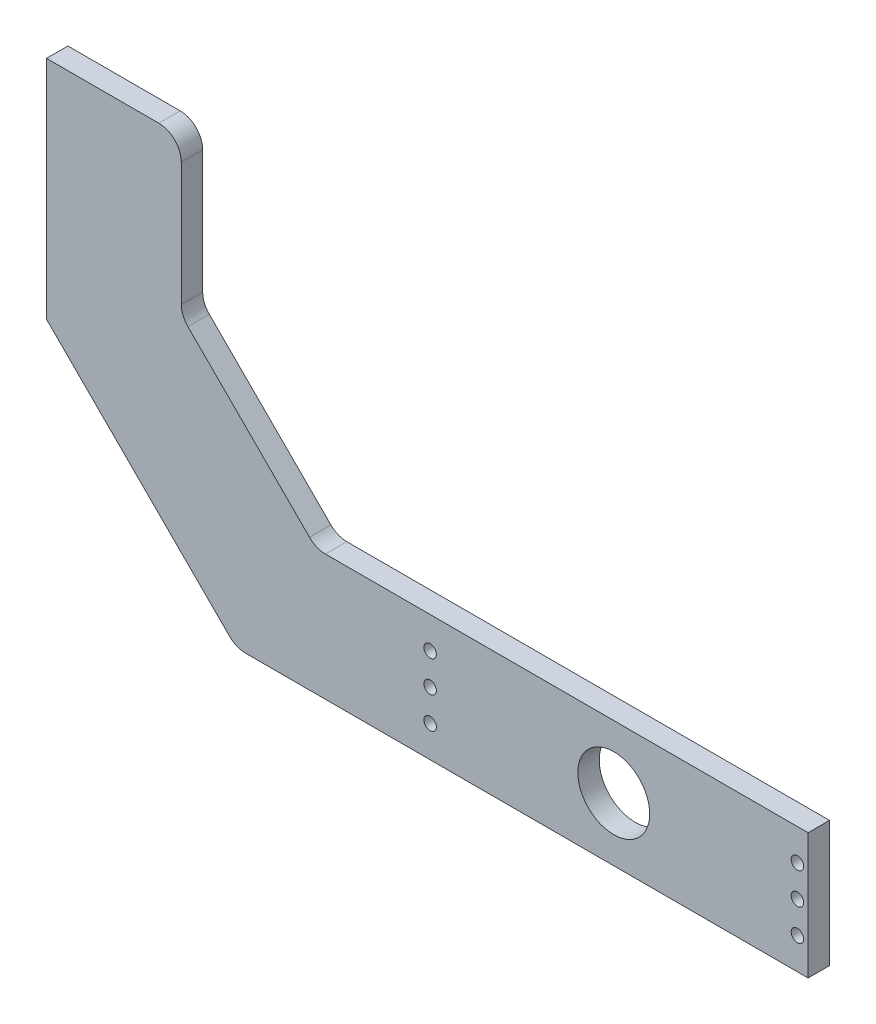
ISO-10303-21;
HEADER;
FILE_DESCRIPTION(('STEP AP214'),'2;1');
FILE_NAME('part.step','',(''),(''),'','','');
FILE_SCHEMA(('AUTOMOTIVE_DESIGN { 1 0 10303 214 1 1 1 1 }'));
ENDSEC;
DATA;
#1=APPLICATION_CONTEXT('core data for automotive mechanical design processes');
#2=APPLICATION_PROTOCOL_DEFINITION('international standard','automotive_design',2000,#1);
#3=PRODUCT_CONTEXT('',#1,'mechanical');
#4=PRODUCT('Part','Part','',(#3));
#5=PRODUCT_RELATED_PRODUCT_CATEGORY('part','',(#4));
#6=PRODUCT_DEFINITION_FORMATION('','',#4);
#7=PRODUCT_DEFINITION_CONTEXT('part definition',#1,'design');
#8=PRODUCT_DEFINITION('design','',#6,#7);
#9=PRODUCT_DEFINITION_SHAPE('','',#8);
#10=(LENGTH_UNIT() NAMED_UNIT(*) SI_UNIT(.MILLI.,.METRE.));
#11=(NAMED_UNIT(*) PLANE_ANGLE_UNIT() SI_UNIT($,.RADIAN.));
#12=(NAMED_UNIT(*) SI_UNIT($,.STERADIAN.) SOLID_ANGLE_UNIT());
#13=UNCERTAINTY_MEASURE_WITH_UNIT(LENGTH_MEASURE(1.E-05),#10,'distance_accuracy_value','');
#14=(GEOMETRIC_REPRESENTATION_CONTEXT(3) GLOBAL_UNCERTAINTY_ASSIGNED_CONTEXT((#13)) GLOBAL_UNIT_ASSIGNED_CONTEXT((#10,
#11,#12)) REPRESENTATION_CONTEXT('',''));
#15=CARTESIAN_POINT('',(0.,0.,0.));
#16=DIRECTION('',(0.,0.,1.));
#17=DIRECTION('',(1.,0.,0.));
#18=AXIS2_PLACEMENT_3D('',#15,#16,#17);
#19=CARTESIAN_POINT('',(18.4222454265078,-36.0239718131345,9.525));
#20=DIRECTION('',(0.,-1.,0.));
#21=DIRECTION('',(1.,0.,0.));
#22=AXIS2_PLACEMENT_3D('',#19,#20,#21);
#23=PLANE('',#22);
#24=DIRECTION('',(-1.,0.,0.));
#25=VECTOR('',#24,1.);
#26=CARTESIAN_POINT('',(18.4222454265078,-36.0239718131345,0.));
#27=LINE('',#26,#25);
#28=CARTESIAN_POINT('',(224.714042280299,-36.0239718131342,0.));
#29=VERTEX_POINT('',#28);
#30=CARTESIAN_POINT('',(9.85617790402953,-36.0239718131345,0.));
#31=VERTEX_POINT('',#30);
#32=EDGE_CURVE('E162',#29,#31,#27,.T.);
#33=ORIENTED_EDGE('',*,*,#32,.T.);
#34=DIRECTION('',(0.,0.,-1.));
#35=VECTOR('',#34,1.);
#36=CARTESIAN_POINT('',(9.85617790402953,-36.0239718131345,9.525));
#37=LINE('',#36,#35);
#38=CARTESIAN_POINT('',(9.85617790402953,-36.0239718131345,9.525));
#39=VERTEX_POINT('',#38);
#40=EDGE_CURVE('E213',#31,#39,#37,.F.);
#41=ORIENTED_EDGE('',*,*,#40,.T.);
#42=DIRECTION('',(-1.,0.,0.));
#43=VECTOR('',#42,1.);
#44=CARTESIAN_POINT('',(18.4222454265078,-36.0239718131345,9.525));
#45=LINE('',#44,#43);
#46=CARTESIAN_POINT('',(224.714042280299,-36.0239718131342,9.525));
#47=VERTEX_POINT('',#46);
#48=EDGE_CURVE('E179',#47,#39,#45,.T.);
#49=ORIENTED_EDGE('',*,*,#48,.F.);
#50=DIRECTION('',(0.,0.,-1.));
#51=VECTOR('',#50,1.);
#52=CARTESIAN_POINT('',(224.714042280299,-36.0239718131342,9.525));
#53=LINE('',#52,#51);
#54=EDGE_CURVE('E161',#47,#29,#53,.T.);
#55=ORIENTED_EDGE('',*,*,#54,.T.);
#56=EDGE_LOOP('',(#33,#41,#49,#55));
#57=FACE_BOUND('',#56,.T.);
#58=ADVANCED_FACE('F33',(#57),#23,.F.);
#59=CARTESIAN_POINT('',(201.815385528004,-232.125315060842,9.525));
#60=DIRECTION('',(-0.707106781186551,-0.707106781186544,0.));
#61=DIRECTION('',(0.707106781186544,-0.707106781186551,0.));
#62=AXIS2_PLACEMENT_3D('',#59,#60,#61);
#63=PLANE('',#62);
#64=DIRECTION('',(-0.707106781186544,0.707106781186551,0.));
#65=VECTOR('',#64,1.);
#66=CARTESIAN_POINT('',(201.815385528004,-232.125315060842,0.));
#67=LINE('',#66,#65);
#68=CARTESIAN_POINT('',(2.78511009216395,-33.0950396249999,0.));
#69=VERTEX_POINT('',#68);
#70=CARTESIAN_POINT('',(-51.3570255315668,21.0470959987314,0.));
#71=VERTEX_POINT('',#70);
#72=EDGE_CURVE('E165',#69,#71,#67,.T.);
#73=ORIENTED_EDGE('',*,*,#72,.T.);
#74=DIRECTION('',(0.,0.,-1.));
#75=VECTOR('',#74,1.);
#76=CARTESIAN_POINT('',(-51.3570255315668,21.0470959987314,9.525));
#77=LINE('',#76,#75);
#78=CARTESIAN_POINT('',(-51.3570255315668,21.0470959987314,9.525));
#79=VERTEX_POINT('',#78);
#80=EDGE_CURVE('E211',#71,#79,#77,.F.);
#81=ORIENTED_EDGE('',*,*,#80,.T.);
#82=DIRECTION('',(-0.707106781186544,0.707106781186551,0.));
#83=VECTOR('',#82,1.);
#84=CARTESIAN_POINT('',(201.815385528004,-232.125315060842,9.525));
#85=LINE('',#84,#83);
#86=CARTESIAN_POINT('',(2.78511009216395,-33.0950396249999,9.525));
#87=VERTEX_POINT('',#86);
#88=EDGE_CURVE('E276',#87,#79,#85,.T.);
#89=ORIENTED_EDGE('',*,*,#88,.F.);
#90=DIRECTION('',(0.,0.,-1.));
#91=VECTOR('',#90,1.);
#92=CARTESIAN_POINT('',(2.78511009216401,-33.0950396249999,0.));
#93=LINE('',#92,#91);
#94=EDGE_CURVE('E208',#87,#69,#93,.T.);
#95=ORIENTED_EDGE('',*,*,#94,.T.);
#96=EDGE_LOOP('',(#73,#81,#89,#95));
#97=FACE_BOUND('',#96,.T.);
#98=ADVANCED_FACE('F293',(#97),#63,.F.);
#99=CARTESIAN_POINT('',(-54.2859577197013,-415.518455162336,9.525));
#100=DIRECTION('',(1.,0.,0.));
#101=DIRECTION('',(0.,1.,0.));
#102=AXIS2_PLACEMENT_3D('',#99,#100,#101);
#103=PLANE('',#102);
#104=DIRECTION('',(0.,-1.,0.));
#105=VECTOR('',#104,1.);
#106=CARTESIAN_POINT('',(-54.2859577197013,-415.518455162336,9.525));
#107=LINE('',#106,#105);
#108=CARTESIAN_POINT('',(-54.2859577197012,82.9760281868659,9.525));
#109=VERTEX_POINT('',#108);
#110=CARTESIAN_POINT('',(-54.2859577197012,28.1181638105968,9.525));
#111=VERTEX_POINT('',#110);
#112=EDGE_CURVE('E156',#109,#111,#107,.T.);
#113=ORIENTED_EDGE('',*,*,#112,.T.);
#114=DIRECTION('',(0.,0.,-1.));
#115=VECTOR('',#114,1.);
#116=CARTESIAN_POINT('',(-54.2859577197012,28.1181638105968,9.525));
#117=LINE('',#116,#115);
#118=CARTESIAN_POINT('',(-54.2859577197012,28.1181638105968,0.));
#119=VERTEX_POINT('',#118);
#120=EDGE_CURVE('E205',#111,#119,#117,.T.);
#121=ORIENTED_EDGE('',*,*,#120,.T.);
#122=DIRECTION('',(0.,-1.,0.));
#123=VECTOR('',#122,1.);
#124=CARTESIAN_POINT('',(-54.2859577197013,-415.518455162336,0.));
#125=LINE('',#124,#123);
#126=CARTESIAN_POINT('',(-54.2859577197012,82.9760281868659,0.));
#127=VERTEX_POINT('',#126);
#128=EDGE_CURVE('E169',#127,#119,#125,.T.);
#129=ORIENTED_EDGE('',*,*,#128,.F.);
#130=DIRECTION('',(0.,0.,-1.));
#131=VECTOR('',#130,1.);
#132=CARTESIAN_POINT('',(-54.2859577197012,82.9760281868659,9.525));
#133=LINE('',#132,#131);
#134=EDGE_CURVE('E192',#127,#109,#133,.F.);
#135=ORIENTED_EDGE('',*,*,#134,.T.);
#136=EDGE_LOOP('',(#113,#121,#129,#135));
#137=FACE_BOUND('',#136,.T.);
#138=ADVANCED_FACE('F282',(#137),#103,.T.);
#139=CARTESIAN_POINT('',(18.4222454265079,92.976028186866,9.525));
#140=DIRECTION('',(0.,-1.,0.));
#141=DIRECTION('',(1.,0.,0.));
#142=AXIS2_PLACEMENT_3D('',#139,#140,#141);
#143=PLANE('',#142);
#144=DIRECTION('',(-1.,0.,0.));
#145=VECTOR('',#144,1.);
#146=CARTESIAN_POINT('',(18.4222454265079,92.976028186866,9.525));
#147=LINE('',#146,#145);
#148=CARTESIAN_POINT('',(-64.2859577197012,92.9760281868659,9.525));
#149=VERTEX_POINT('',#148);
#150=CARTESIAN_POINT('',(-114.285957719701,92.9760281868659,9.525));
#151=VERTEX_POINT('',#150);
#152=EDGE_CURVE('E150',#149,#151,#147,.T.);
#153=ORIENTED_EDGE('',*,*,#152,.F.);
#154=DIRECTION('',(0.,0.,-1.));
#155=VECTOR('',#154,1.);
#156=CARTESIAN_POINT('',(-64.2859577197012,92.9760281868659,0.));
#157=LINE('',#156,#155);
#158=CARTESIAN_POINT('',(-64.2859577197012,92.9760281868659,0.));
#159=VERTEX_POINT('',#158);
#160=EDGE_CURVE('E224',#149,#159,#157,.T.);
#161=ORIENTED_EDGE('',*,*,#160,.T.);
#162=DIRECTION('',(-1.,0.,0.));
#163=VECTOR('',#162,1.);
#164=CARTESIAN_POINT('',(18.4222454265079,92.976028186866,0.));
#165=LINE('',#164,#163);
#166=CARTESIAN_POINT('',(-114.285957719701,92.9760281868659,0.));
#167=VERTEX_POINT('',#166);
#168=EDGE_CURVE('E172',#159,#167,#165,.T.);
#169=ORIENTED_EDGE('',*,*,#168,.T.);
#170=DIRECTION('',(0.,0.,-1.));
#171=VECTOR('',#170,1.);
#172=CARTESIAN_POINT('',(-114.285957719701,92.9760281868659,9.525));
#173=LINE('',#172,#171);
#174=EDGE_CURVE('E185',#151,#167,#173,.T.);
#175=ORIENTED_EDGE('',*,*,#174,.F.);
#176=EDGE_LOOP('',(#153,#161,#169,#175));
#177=FACE_BOUND('',#176,.T.);
#178=ADVANCED_FACE('F320',(#177),#143,.F.);
#179=CARTESIAN_POINT('',(-114.285957719701,-415.518455162336,9.525));
#180=DIRECTION('',(1.,0.,0.));
#181=DIRECTION('',(0.,1.,0.));
#182=AXIS2_PLACEMENT_3D('',#179,#180,#181);
#183=PLANE('',#182);
#184=CARTESIAN_POINT('',(-114.285957719701,17.976028186866,4.76250000000001));
#185=DIRECTION('',(-1.,0.,0.));
#186=DIRECTION('',(0.,-1.,0.));
#187=AXIS2_PLACEMENT_3D('',#184,#185,#186);
#188=CIRCLE('',#187,2.5);
#189=CARTESIAN_POINT('',(-114.285957719701,15.476028186866,4.76250000000001));
#190=VERTEX_POINT('',#189);
#191=EDGE_CURVE('E145',#190,#190,#188,.T.);
#192=ORIENTED_EDGE('',*,*,#191,.F.);
#193=EDGE_LOOP('',(#192));
#194=FACE_BOUND('',#193,.T.);
#195=CARTESIAN_POINT('',(-114.285957719701,42.9760281868658,4.76250000000001));
#196=DIRECTION('',(-1.,0.,0.));
#197=DIRECTION('',(0.,-1.,0.));
#198=AXIS2_PLACEMENT_3D('',#195,#196,#197);
#199=CIRCLE('',#198,2.5);
#200=CARTESIAN_POINT('',(-114.285957719701,40.4760281868658,4.76250000000001));
#201=VERTEX_POINT('',#200);
#202=EDGE_CURVE('E258',#201,#201,#199,.T.);
#203=ORIENTED_EDGE('',*,*,#202,.F.);
#204=EDGE_LOOP('',(#203));
#205=FACE_BOUND('',#204,.T.);
#206=CARTESIAN_POINT('',(-114.285957719701,67.9760281868655,4.7625));
#207=DIRECTION('',(-1.,0.,0.));
#208=DIRECTION('',(0.,-1.,0.));
#209=AXIS2_PLACEMENT_3D('',#206,#207,#208);
#210=CIRCLE('',#209,2.5);
#211=CARTESIAN_POINT('',(-114.285957719701,65.4760281868655,4.7625));
#212=VERTEX_POINT('',#211);
#213=EDGE_CURVE('E264',#212,#212,#210,.T.);
#214=ORIENTED_EDGE('',*,*,#213,.F.);
#215=EDGE_LOOP('',(#214));
#216=FACE_BOUND('',#215,.T.);
#217=DIRECTION('',(0.,-1.,0.));
#218=VECTOR('',#217,1.);
#219=CARTESIAN_POINT('',(-114.285957719701,-415.518455162336,0.));
#220=LINE('',#219,#218);
#221=CARTESIAN_POINT('',(-114.285957719701,-7.57988285569766,0.));
#222=VERTEX_POINT('',#221);
#223=EDGE_CURVE('E144',#167,#222,#220,.T.);
#224=ORIENTED_EDGE('',*,*,#223,.T.);
#225=DIRECTION('',(0.,0.,1.));
#226=VECTOR('',#225,1.);
#227=CARTESIAN_POINT('',(-114.285957719701,-7.57988285569773,-0.475));
#228=LINE('',#227,#226);
#229=CARTESIAN_POINT('',(-114.285957719701,-7.57988285569773,9.525));
#230=VERTEX_POINT('',#229);
#231=EDGE_CURVE('E130',#222,#230,#228,.T.);
#232=ORIENTED_EDGE('',*,*,#231,.T.);
#233=DIRECTION('',(0.,-1.,0.));
#234=VECTOR('',#233,1.);
#235=CARTESIAN_POINT('',(-114.285957719701,-415.518455162336,9.525));
#236=LINE('',#235,#234);
#237=EDGE_CURVE('E142',#151,#230,#236,.T.);
#238=ORIENTED_EDGE('',*,*,#237,.F.);
#239=ORIENTED_EDGE('',*,*,#174,.T.);
#240=EDGE_LOOP('',(#224,#232,#238,#239));
#241=FACE_BOUND('',#240,.T.);
#242=ADVANCED_FACE('F140',(#194,#205,#216,#241),#183,.F.);
#243=CARTESIAN_POINT('',(18.4222454265084,-92.0239718131342,9.525));
#244=DIRECTION('',(0.,1.,0.));
#245=DIRECTION('',(-1.,0.,0.));
#246=AXIS2_PLACEMENT_3D('',#243,#244,#245);
#247=PLANE('',#246);
#248=DIRECTION('',(1.,0.,0.));
#249=VECTOR('',#248,1.);
#250=CARTESIAN_POINT('',(18.4222454265084,-92.0239718131342,9.525));
#251=LINE('',#250,#249);
#252=CARTESIAN_POINT('',(-25.6997331385348,-92.0239718131342,9.525));
#253=VERTEX_POINT('',#252);
#254=CARTESIAN_POINT('',(224.714042280299,-92.0239718131341,9.525));
#255=VERTEX_POINT('',#254);
#256=EDGE_CURVE('E152',#253,#255,#251,.T.);
#257=ORIENTED_EDGE('',*,*,#256,.F.);
#258=DIRECTION('',(0.,0.,1.));
#259=VECTOR('',#258,1.);
#260=CARTESIAN_POINT('',(-25.6997331385348,-92.0239718131342,9.525));
#261=LINE('',#260,#259);
#262=CARTESIAN_POINT('',(-25.6997331385348,-92.0239718131342,0.));
#263=VERTEX_POINT('',#262);
#264=EDGE_CURVE('E58',#253,#263,#261,.F.);
#265=ORIENTED_EDGE('',*,*,#264,.T.);
#266=DIRECTION('',(1.,0.,0.));
#267=VECTOR('',#266,1.);
#268=CARTESIAN_POINT('',(18.4222454265084,-92.0239718131342,0.));
#269=LINE('',#268,#267);
#270=CARTESIAN_POINT('',(224.714042280299,-92.0239718131341,0.));
#271=VERTEX_POINT('',#270);
#272=EDGE_CURVE('E175',#263,#271,#269,.T.);
#273=ORIENTED_EDGE('',*,*,#272,.T.);
#274=DIRECTION('',(0.,0.,-1.));
#275=VECTOR('',#274,1.);
#276=CARTESIAN_POINT('',(224.714042280299,-92.0239718131341,9.525));
#277=LINE('',#276,#275);
#278=EDGE_CURVE('E182',#255,#271,#277,.T.);
#279=ORIENTED_EDGE('',*,*,#278,.F.);
#280=EDGE_LOOP('',(#257,#265,#273,#279));
#281=FACE_BOUND('',#280,.T.);
#282=ADVANCED_FACE('F312',(#281),#247,.F.);
#283=CARTESIAN_POINT('',(224.714042280299,-415.518455162336,9.525));
#284=DIRECTION('',(-1.,0.,0.));
#285=DIRECTION('',(0.,0.,1.));
#286=AXIS2_PLACEMENT_3D('',#283,#284,#285);
#287=PLANE('',#286);
#288=DIRECTION('',(0.,1.,0.));
#289=VECTOR('',#288,1.);
#290=CARTESIAN_POINT('',(224.714042280299,-415.518455162336,0.));
#291=LINE('',#290,#289);
#292=EDGE_CURVE('E177',#271,#29,#291,.T.);
#293=ORIENTED_EDGE('',*,*,#292,.T.);
#294=ORIENTED_EDGE('',*,*,#54,.F.);
#295=DIRECTION('',(0.,1.,0.));
#296=VECTOR('',#295,1.);
#297=CARTESIAN_POINT('',(224.714042280299,-415.518455162336,9.525));
#298=LINE('',#297,#296);
#299=EDGE_CURVE('E154',#255,#47,#298,.T.);
#300=ORIENTED_EDGE('',*,*,#299,.F.);
#301=ORIENTED_EDGE('',*,*,#278,.T.);
#302=EDGE_LOOP('',(#293,#294,#300,#301));
#303=FACE_BOUND('',#302,.T.);
#304=ADVANCED_FACE('F307',(#303),#287,.F.);
#305=CARTESIAN_POINT('',(18.4222454265084,-415.518455162336,9.525));
#306=DIRECTION('',(0.,0.,1.));
#307=DIRECTION('',(1.,0.,0.));
#308=AXIS2_PLACEMENT_3D('',#305,#306,#307);
#309=PLANE('',#308);
#310=CARTESIAN_POINT('',(219.954042280299,-50.0239718131341,9.525));
#311=DIRECTION('',(0.,0.,1.));
#312=DIRECTION('',(1.,0.,0.));
#313=AXIS2_PLACEMENT_3D('',#310,#311,#312);
#314=CIRCLE('',#313,2.78000000000001);
#315=CARTESIAN_POINT('',(222.734042280299,-50.0239718131341,9.525));
#316=VERTEX_POINT('',#315);
#317=EDGE_CURVE('E246',#316,#316,#314,.T.);
#318=ORIENTED_EDGE('',*,*,#317,.F.);
#319=EDGE_LOOP('',(#318));
#320=FACE_BOUND('',#319,.T.);
#321=CARTESIAN_POINT('',(219.954042280299,-64.0239718131341,9.525));
#322=DIRECTION('',(0.,0.,1.));
#323=DIRECTION('',(1.,0.,0.));
#324=AXIS2_PLACEMENT_3D('',#321,#322,#323);
#325=CIRCLE('',#324,2.78000000000001);
#326=CARTESIAN_POINT('',(222.734042280299,-64.0239718131341,9.525));
#327=VERTEX_POINT('',#326);
#328=EDGE_CURVE('E236',#327,#327,#325,.T.);
#329=ORIENTED_EDGE('',*,*,#328,.F.);
#330=EDGE_LOOP('',(#329));
#331=FACE_BOUND('',#330,.T.);
#332=CARTESIAN_POINT('',(219.954042280299,-78.0239718131342,9.525));
#333=DIRECTION('',(0.,0.,1.));
#334=DIRECTION('',(1.,0.,0.));
#335=AXIS2_PLACEMENT_3D('',#332,#333,#334);
#336=CIRCLE('',#335,2.78000000000001);
#337=CARTESIAN_POINT('',(222.734042280299,-78.0239718131342,9.525));
#338=VERTEX_POINT('',#337);
#339=EDGE_CURVE('E233',#338,#338,#336,.T.);
#340=ORIENTED_EDGE('',*,*,#339,.F.);
#341=EDGE_LOOP('',(#340));
#342=FACE_BOUND('',#341,.T.);
#343=CARTESIAN_POINT('',(56.4740422802987,-78.0239718131351,9.525));
#344=DIRECTION('',(0.,0.,1.));
#345=DIRECTION('',(1.,0.,0.));
#346=AXIS2_PLACEMENT_3D('',#343,#344,#345);
#347=CIRCLE('',#346,2.78000000000004);
#348=CARTESIAN_POINT('',(59.2540422802988,-78.0239718131351,9.525));
#349=VERTEX_POINT('',#348);
#350=EDGE_CURVE('E203',#349,#349,#347,.T.);
#351=ORIENTED_EDGE('',*,*,#350,.F.);
#352=EDGE_LOOP('',(#351));
#353=FACE_BOUND('',#352,.T.);
#354=CARTESIAN_POINT('',(56.4740422802987,-64.0239718131351,9.525));
#355=DIRECTION('',(0.,0.,1.));
#356=DIRECTION('',(1.,0.,0.));
#357=AXIS2_PLACEMENT_3D('',#354,#355,#356);
#358=CIRCLE('',#357,2.78000000000004);
#359=CARTESIAN_POINT('',(59.2540422802988,-64.0239718131351,9.525));
#360=VERTEX_POINT('',#359);
#361=EDGE_CURVE('E199',#360,#360,#358,.T.);
#362=ORIENTED_EDGE('',*,*,#361,.F.);
#363=EDGE_LOOP('',(#362));
#364=FACE_BOUND('',#363,.T.);
#365=CARTESIAN_POINT('',(56.4740422802987,-50.0239718131351,9.525));
#366=DIRECTION('',(0.,0.,1.));
#367=DIRECTION('',(1.,0.,0.));
#368=AXIS2_PLACEMENT_3D('',#365,#366,#367);
#369=CIRCLE('',#368,2.78);
#370=CARTESIAN_POINT('',(59.2540422802987,-50.0239718131351,9.525));
#371=VERTEX_POINT('',#370);
#372=EDGE_CURVE('E195',#371,#371,#369,.T.);
#373=ORIENTED_EDGE('',*,*,#372,.F.);
#374=EDGE_LOOP('',(#373));
#375=FACE_BOUND('',#374,.T.);
#376=DIRECTION('',(-0.707106781186544,0.707106781186551,0.));
#377=VECTOR('',#376,1.);
#378=CARTESIAN_POINT('',(-29.8418687622657,-92.0239718131342,9.525));
#379=LINE('',#378,#377);
#380=CARTESIAN_POINT('',(-32.7708009504003,-89.0950396249996,9.525));
#381=VERTEX_POINT('',#380);
#382=EDGE_CURVE('E126',#381,#230,#379,.T.);
#383=ORIENTED_EDGE('',*,*,#382,.F.);
#384=CARTESIAN_POINT('',(-25.6997331385348,-82.0239718131342,9.525));
#385=DIRECTION('',(0.,0.,1.));
#386=DIRECTION('',(1.,0.,0.));
#387=AXIS2_PLACEMENT_3D('',#384,#385,#386);
#388=CIRCLE('',#387,10.);
#389=EDGE_CURVE('E218',#381,#253,#388,.T.);
#390=ORIENTED_EDGE('',*,*,#389,.T.);
#391=ORIENTED_EDGE('',*,*,#256,.T.);
#392=ORIENTED_EDGE('',*,*,#299,.T.);
#393=ORIENTED_EDGE('',*,*,#48,.T.);
#394=CARTESIAN_POINT('',(9.85617790402951,-26.0239718131345,9.525));
#395=DIRECTION('',(0.,0.,1.));
#396=DIRECTION('',(1.,0.,0.));
#397=AXIS2_PLACEMENT_3D('',#394,#395,#396);
#398=CIRCLE('',#397,10.);
#399=EDGE_CURVE('E11',#39,#87,#398,.F.);
#400=ORIENTED_EDGE('',*,*,#399,.T.);
#401=ORIENTED_EDGE('',*,*,#88,.T.);
#402=CARTESIAN_POINT('',(-44.2859577197012,28.1181638105968,9.525));
#403=DIRECTION('',(0.,0.,1.));
#404=DIRECTION('',(1.,0.,0.));
#405=AXIS2_PLACEMENT_3D('',#402,#403,#404);
#406=CIRCLE('',#405,10.);
#407=EDGE_CURVE('E228',#79,#111,#406,.F.);
#408=ORIENTED_EDGE('',*,*,#407,.T.);
#409=ORIENTED_EDGE('',*,*,#112,.F.);
#410=CARTESIAN_POINT('',(-64.2859577197012,82.9760281868659,9.525));
#411=DIRECTION('',(0.,0.,1.));
#412=DIRECTION('',(1.,0.,0.));
#413=AXIS2_PLACEMENT_3D('',#410,#411,#412);
#414=CIRCLE('',#413,10.);
#415=EDGE_CURVE('E216',#109,#149,#414,.T.);
#416=ORIENTED_EDGE('',*,*,#415,.T.);
#417=ORIENTED_EDGE('',*,*,#152,.T.);
#418=ORIENTED_EDGE('',*,*,#237,.T.);
#419=EDGE_LOOP('',(#383,#390,#391,#392,#393,#400,#401,#408,#409,#416,#417,#418));
#420=FACE_BOUND('',#419,.T.);
#421=CARTESIAN_POINT('',(138.214042280299,-64.0239718131342,9.525));
#422=DIRECTION('',(0.,0.,1.));
#423=DIRECTION('',(1.,0.,0.));
#424=AXIS2_PLACEMENT_3D('',#421,#422,#423);
#425=CIRCLE('',#424,16.);
#426=CARTESIAN_POINT('',(154.214042280299,-64.0239718131342,9.525));
#427=VERTEX_POINT('',#426);
#428=EDGE_CURVE('E190',#427,#427,#425,.T.);
#429=ORIENTED_EDGE('',*,*,#428,.F.);
#430=EDGE_LOOP('',(#429));
#431=FACE_BOUND('',#430,.T.);
#432=ADVANCED_FACE('F147',(#320,#331,#342,#353,#364,#375,#420,#431),#309,.T.);
#433=CARTESIAN_POINT('',(18.4222454265084,-415.518455162336,0.));
#434=DIRECTION('',(0.,0.,1.));
#435=DIRECTION('',(1.,0.,0.));
#436=AXIS2_PLACEMENT_3D('',#433,#434,#435);
#437=PLANE('',#436);
#438=CARTESIAN_POINT('',(219.954042280299,-50.0239718131341,0.));
#439=DIRECTION('',(0.,0.,1.));
#440=DIRECTION('',(1.,0.,0.));
#441=AXIS2_PLACEMENT_3D('',#438,#439,#440);
#442=CIRCLE('',#441,2.78000000000001);
#443=CARTESIAN_POINT('',(222.734042280299,-50.0239718131341,0.));
#444=VERTEX_POINT('',#443);
#445=EDGE_CURVE('E37',#444,#444,#442,.T.);
#446=ORIENTED_EDGE('',*,*,#445,.T.);
#447=EDGE_LOOP('',(#446));
#448=FACE_BOUND('',#447,.T.);
#449=CARTESIAN_POINT('',(219.954042280299,-64.0239718131341,0.));
#450=DIRECTION('',(0.,0.,1.));
#451=DIRECTION('',(1.,0.,0.));
#452=AXIS2_PLACEMENT_3D('',#449,#450,#451);
#453=CIRCLE('',#452,2.78000000000001);
#454=CARTESIAN_POINT('',(222.734042280299,-64.0239718131341,0.));
#455=VERTEX_POINT('',#454);
#456=EDGE_CURVE('E234',#455,#455,#453,.T.);
#457=ORIENTED_EDGE('',*,*,#456,.T.);
#458=EDGE_LOOP('',(#457));
#459=FACE_BOUND('',#458,.T.);
#460=CARTESIAN_POINT('',(219.954042280299,-78.0239718131342,0.));
#461=DIRECTION('',(0.,0.,1.));
#462=DIRECTION('',(1.,0.,0.));
#463=AXIS2_PLACEMENT_3D('',#460,#461,#462);
#464=CIRCLE('',#463,2.78000000000001);
#465=CARTESIAN_POINT('',(222.734042280299,-78.0239718131342,0.));
#466=VERTEX_POINT('',#465);
#467=EDGE_CURVE('E231',#466,#466,#464,.T.);
#468=ORIENTED_EDGE('',*,*,#467,.T.);
#469=EDGE_LOOP('',(#468));
#470=FACE_BOUND('',#469,.T.);
#471=CARTESIAN_POINT('',(56.4740422802987,-78.0239718131351,0.));
#472=DIRECTION('',(0.,0.,1.));
#473=DIRECTION('',(1.,0.,0.));
#474=AXIS2_PLACEMENT_3D('',#471,#472,#473);
#475=CIRCLE('',#474,2.78000000000004);
#476=CARTESIAN_POINT('',(59.2540422802988,-78.0239718131351,0.));
#477=VERTEX_POINT('',#476);
#478=EDGE_CURVE('E200',#477,#477,#475,.T.);
#479=ORIENTED_EDGE('',*,*,#478,.T.);
#480=EDGE_LOOP('',(#479));
#481=FACE_BOUND('',#480,.T.);
#482=CARTESIAN_POINT('',(56.4740422802987,-64.0239718131351,0.));
#483=DIRECTION('',(0.,0.,1.));
#484=DIRECTION('',(1.,0.,0.));
#485=AXIS2_PLACEMENT_3D('',#482,#483,#484);
#486=CIRCLE('',#485,2.78000000000004);
#487=CARTESIAN_POINT('',(59.2540422802988,-64.0239718131351,0.));
#488=VERTEX_POINT('',#487);
#489=EDGE_CURVE('E196',#488,#488,#486,.T.);
#490=ORIENTED_EDGE('',*,*,#489,.T.);
#491=EDGE_LOOP('',(#490));
#492=FACE_BOUND('',#491,.T.);
#493=CARTESIAN_POINT('',(56.4740422802987,-50.0239718131351,0.));
#494=DIRECTION('',(0.,0.,1.));
#495=DIRECTION('',(1.,0.,0.));
#496=AXIS2_PLACEMENT_3D('',#493,#494,#495);
#497=CIRCLE('',#496,2.78);
#498=CARTESIAN_POINT('',(59.2540422802987,-50.0239718131351,0.));
#499=VERTEX_POINT('',#498);
#500=EDGE_CURVE('E136',#499,#499,#497,.T.);
#501=ORIENTED_EDGE('',*,*,#500,.T.);
#502=EDGE_LOOP('',(#501));
#503=FACE_BOUND('',#502,.T.);
#504=CARTESIAN_POINT('',(138.214042280299,-64.0239718131342,0.));
#505=DIRECTION('',(0.,0.,1.));
#506=DIRECTION('',(1.,0.,0.));
#507=AXIS2_PLACEMENT_3D('',#504,#505,#506);
#508=CIRCLE('',#507,16.);
#509=CARTESIAN_POINT('',(154.214042280299,-64.0239718131342,0.));
#510=VERTEX_POINT('',#509);
#511=EDGE_CURVE('E166',#510,#510,#508,.T.);
#512=ORIENTED_EDGE('',*,*,#511,.T.);
#513=EDGE_LOOP('',(#512));
#514=FACE_BOUND('',#513,.T.);
#515=ORIENTED_EDGE('',*,*,#272,.F.);
#516=CARTESIAN_POINT('',(-25.6997331385348,-82.0239718131342,0.));
#517=DIRECTION('',(0.,0.,1.));
#518=DIRECTION('',(1.,0.,0.));
#519=AXIS2_PLACEMENT_3D('',#516,#517,#518);
#520=CIRCLE('',#519,10.);
#521=CARTESIAN_POINT('',(-32.7708009504003,-89.0950396249996,0.));
#522=VERTEX_POINT('',#521);
#523=EDGE_CURVE('E222',#263,#522,#520,.F.);
#524=ORIENTED_EDGE('',*,*,#523,.T.);
#525=DIRECTION('',(-0.707106781186544,0.707106781186551,0.));
#526=VECTOR('',#525,1.);
#527=CARTESIAN_POINT('',(156.037430006722,-277.903270582124,0.));
#528=LINE('',#527,#526);
#529=EDGE_CURVE('E187',#522,#222,#528,.T.);
#530=ORIENTED_EDGE('',*,*,#529,.T.);
#531=ORIENTED_EDGE('',*,*,#223,.F.);
#532=ORIENTED_EDGE('',*,*,#168,.F.);
#533=CARTESIAN_POINT('',(-64.2859577197012,82.9760281868659,0.));
#534=DIRECTION('',(0.,0.,1.));
#535=DIRECTION('',(1.,0.,0.));
#536=AXIS2_PLACEMENT_3D('',#533,#534,#535);
#537=CIRCLE('',#536,10.);
#538=EDGE_CURVE('E50',#159,#127,#537,.F.);
#539=ORIENTED_EDGE('',*,*,#538,.T.);
#540=ORIENTED_EDGE('',*,*,#128,.T.);
#541=CARTESIAN_POINT('',(-44.2859577197012,28.1181638105968,0.));
#542=DIRECTION('',(0.,0.,1.));
#543=DIRECTION('',(1.,0.,0.));
#544=AXIS2_PLACEMENT_3D('',#541,#542,#543);
#545=CIRCLE('',#544,10.);
#546=EDGE_CURVE('E226',#119,#71,#545,.T.);
#547=ORIENTED_EDGE('',*,*,#546,.T.);
#548=ORIENTED_EDGE('',*,*,#72,.F.);
#549=CARTESIAN_POINT('',(9.85617790402951,-26.0239718131345,0.));
#550=DIRECTION('',(0.,0.,1.));
#551=DIRECTION('',(1.,0.,0.));
#552=AXIS2_PLACEMENT_3D('',#549,#550,#551);
#553=CIRCLE('',#552,10.);
#554=EDGE_CURVE('E42',#69,#31,#553,.T.);
#555=ORIENTED_EDGE('',*,*,#554,.T.);
#556=ORIENTED_EDGE('',*,*,#32,.F.);
#557=ORIENTED_EDGE('',*,*,#292,.F.);
#558=EDGE_LOOP('',(#515,#524,#530,#531,#532,#539,#540,#547,#548,#555,#556,#557));
#559=FACE_BOUND('',#558,.T.);
#560=ADVANCED_FACE('F291',(#448,#459,#470,#481,#492,#503,#514,#559),#437,.F.);
#561=CARTESIAN_POINT('',(138.214042280299,-64.0239718131342,-0.475));
#562=DIRECTION('',(0.,0.,1.));
#563=DIRECTION('',(1.,0.,0.));
#564=AXIS2_PLACEMENT_3D('',#561,#562,#563);
#565=CYLINDRICAL_SURFACE('',#564,16.);
#566=ORIENTED_EDGE('',*,*,#428,.T.);
#567=EDGE_LOOP('',(#566));
#568=FACE_BOUND('',#567,.T.);
#569=ORIENTED_EDGE('',*,*,#511,.F.);
#570=EDGE_LOOP('',(#569));
#571=FACE_BOUND('',#570,.T.);
#572=ADVANCED_FACE('F463',(#568,#571),#565,.F.);
#573=CARTESIAN_POINT('',(-84.2859577197013,67.9760281868655,4.7625));
#574=DIRECTION('',(-1.,0.,0.));
#575=DIRECTION('',(0.,-1.,0.));
#576=AXIS2_PLACEMENT_3D('',#573,#574,#575);
#577=CYLINDRICAL_SURFACE('',#576,2.5);
#578=CARTESIAN_POINT('',(-84.2859577197013,67.9760281868655,4.7625));
#579=DIRECTION('',(-1.,0.,0.));
#580=DIRECTION('',(0.,-1.,0.));
#581=AXIS2_PLACEMENT_3D('',#578,#579,#580);
#582=CIRCLE('',#581,2.5);
#583=CARTESIAN_POINT('',(-84.2859577197013,65.4760281868655,4.7625));
#584=VERTEX_POINT('',#583);
#585=EDGE_CURVE('E267',#584,#584,#582,.T.);
#586=ORIENTED_EDGE('',*,*,#585,.F.);
#587=EDGE_LOOP('',(#586));
#588=FACE_BOUND('',#587,.T.);
#589=ORIENTED_EDGE('',*,*,#213,.T.);
#590=EDGE_LOOP('',(#589));
#591=FACE_BOUND('',#590,.T.);
#592=ADVANCED_FACE('F453',(#588,#591),#577,.F.);
#593=CARTESIAN_POINT('',(-84.2859577197013,67.9760281868655,4.7625));
#594=DIRECTION('',(-1.,0.,0.));
#595=DIRECTION('',(0.,-1.,0.));
#596=AXIS2_PLACEMENT_3D('',#593,#594,#595);
#597=PLANE('',#596);
#598=ORIENTED_EDGE('',*,*,#585,.T.);
#599=EDGE_LOOP('',(#598));
#600=FACE_BOUND('',#599,.T.);
#601=ADVANCED_FACE('F443',(#600),#597,.T.);
#602=CARTESIAN_POINT('',(-84.2859577197013,42.9760281868658,4.76250000000001));
#603=DIRECTION('',(-1.,0.,0.));
#604=DIRECTION('',(0.,-1.,0.));
#605=AXIS2_PLACEMENT_3D('',#602,#603,#604);
#606=CYLINDRICAL_SURFACE('',#605,2.5);
#607=CARTESIAN_POINT('',(-84.2859577197013,42.9760281868658,4.76250000000001));
#608=DIRECTION('',(-1.,0.,0.));
#609=DIRECTION('',(0.,-1.,0.));
#610=AXIS2_PLACEMENT_3D('',#607,#608,#609);
#611=CIRCLE('',#610,2.5);
#612=CARTESIAN_POINT('',(-84.2859577197013,40.4760281868658,4.76250000000001));
#613=VERTEX_POINT('',#612);
#614=EDGE_CURVE('E261',#613,#613,#611,.T.);
#615=ORIENTED_EDGE('',*,*,#614,.F.);
#616=EDGE_LOOP('',(#615));
#617=FACE_BOUND('',#616,.T.);
#618=ORIENTED_EDGE('',*,*,#202,.T.);
#619=EDGE_LOOP('',(#618));
#620=FACE_BOUND('',#619,.T.);
#621=ADVANCED_FACE('F433',(#617,#620),#606,.F.);
#622=CARTESIAN_POINT('',(-84.2859577197013,42.9760281868658,4.76250000000001));
#623=DIRECTION('',(-1.,0.,0.));
#624=DIRECTION('',(0.,-1.,0.));
#625=AXIS2_PLACEMENT_3D('',#622,#623,#624);
#626=PLANE('',#625);
#627=ORIENTED_EDGE('',*,*,#614,.T.);
#628=EDGE_LOOP('',(#627));
#629=FACE_BOUND('',#628,.T.);
#630=ADVANCED_FACE('F423',(#629),#626,.T.);
#631=CARTESIAN_POINT('',(-84.2859577197013,17.976028186866,4.76250000000001));
#632=DIRECTION('',(-1.,0.,0.));
#633=DIRECTION('',(0.,-1.,0.));
#634=AXIS2_PLACEMENT_3D('',#631,#632,#633);
#635=CYLINDRICAL_SURFACE('',#634,2.5);
#636=CARTESIAN_POINT('',(-84.2859577197013,17.976028186866,4.76250000000001));
#637=DIRECTION('',(-1.,0.,0.));
#638=DIRECTION('',(0.,-1.,0.));
#639=AXIS2_PLACEMENT_3D('',#636,#637,#638);
#640=CIRCLE('',#639,2.5);
#641=CARTESIAN_POINT('',(-84.2859577197013,15.476028186866,4.76250000000001));
#642=VERTEX_POINT('',#641);
#643=EDGE_CURVE('E255',#642,#642,#640,.T.);
#644=ORIENTED_EDGE('',*,*,#643,.F.);
#645=EDGE_LOOP('',(#644));
#646=FACE_BOUND('',#645,.T.);
#647=ORIENTED_EDGE('',*,*,#191,.T.);
#648=EDGE_LOOP('',(#647));
#649=FACE_BOUND('',#648,.T.);
#650=ADVANCED_FACE('F413',(#646,#649),#635,.F.);
#651=CARTESIAN_POINT('',(-84.2859577197013,17.976028186866,4.76250000000001));
#652=DIRECTION('',(-1.,0.,0.));
#653=DIRECTION('',(0.,-1.,0.));
#654=AXIS2_PLACEMENT_3D('',#651,#652,#653);
#655=PLANE('',#654);
#656=ORIENTED_EDGE('',*,*,#643,.T.);
#657=EDGE_LOOP('',(#656));
#658=FACE_BOUND('',#657,.T.);
#659=ADVANCED_FACE('F408',(#658),#655,.T.);
#660=CARTESIAN_POINT('',(-29.8418687622657,-92.0239718131342,-0.475));
#661=DIRECTION('',(0.707106781186551,0.707106781186544,0.));
#662=DIRECTION('',(-0.707106781186544,0.707106781186551,0.));
#663=AXIS2_PLACEMENT_3D('',#660,#661,#662);
#664=PLANE('',#663);
#665=ORIENTED_EDGE('',*,*,#529,.F.);
#666=DIRECTION('',(0.,0.,1.));
#667=VECTOR('',#666,1.);
#668=CARTESIAN_POINT('',(-32.7708009504003,-89.0950396249996,-0.475));
#669=LINE('',#668,#667);
#670=EDGE_CURVE('E133',#522,#381,#669,.T.);
#671=ORIENTED_EDGE('',*,*,#670,.T.);
#672=ORIENTED_EDGE('',*,*,#382,.T.);
#673=ORIENTED_EDGE('',*,*,#231,.F.);
#674=EDGE_LOOP('',(#665,#671,#672,#673));
#675=FACE_BOUND('',#674,.T.);
#676=ADVANCED_FACE('F129',(#675),#664,.F.);
#677=CARTESIAN_POINT('',(56.4740422802987,-50.0239718131351,-0.475));
#678=DIRECTION('',(0.,0.,1.));
#679=DIRECTION('',(1.,0.,0.));
#680=AXIS2_PLACEMENT_3D('',#677,#678,#679);
#681=CYLINDRICAL_SURFACE('',#680,2.78);
#682=ORIENTED_EDGE('',*,*,#372,.T.);
#683=EDGE_LOOP('',(#682));
#684=FACE_BOUND('',#683,.T.);
#685=ORIENTED_EDGE('',*,*,#500,.F.);
#686=EDGE_LOOP('',(#685));
#687=FACE_BOUND('',#686,.T.);
#688=ADVANCED_FACE('F383',(#684,#687),#681,.F.);
#689=CARTESIAN_POINT('',(56.4740422802987,-64.0239718131351,-0.475));
#690=DIRECTION('',(0.,0.,1.));
#691=DIRECTION('',(1.,0.,0.));
#692=AXIS2_PLACEMENT_3D('',#689,#690,#691);
#693=CYLINDRICAL_SURFACE('',#692,2.78000000000004);
#694=ORIENTED_EDGE('',*,*,#361,.T.);
#695=EDGE_LOOP('',(#694));
#696=FACE_BOUND('',#695,.T.);
#697=ORIENTED_EDGE('',*,*,#489,.F.);
#698=EDGE_LOOP('',(#697));
#699=FACE_BOUND('',#698,.T.);
#700=ADVANCED_FACE('F372',(#696,#699),#693,.F.);
#701=CARTESIAN_POINT('',(56.4740422802987,-78.0239718131351,-0.475));
#702=DIRECTION('',(0.,0.,1.));
#703=DIRECTION('',(1.,0.,0.));
#704=AXIS2_PLACEMENT_3D('',#701,#702,#703);
#705=CYLINDRICAL_SURFACE('',#704,2.78000000000004);
#706=ORIENTED_EDGE('',*,*,#350,.T.);
#707=EDGE_LOOP('',(#706));
#708=FACE_BOUND('',#707,.T.);
#709=ORIENTED_EDGE('',*,*,#478,.F.);
#710=EDGE_LOOP('',(#709));
#711=FACE_BOUND('',#710,.T.);
#712=ADVANCED_FACE('F333',(#708,#711),#705,.F.);
#713=CARTESIAN_POINT('',(-44.2859577197012,28.1181638105968,9.525));
#714=DIRECTION('',(0.,0.,-1.));
#715=DIRECTION('',(-1.,0.,0.));
#716=AXIS2_PLACEMENT_3D('',#713,#714,#715);
#717=CYLINDRICAL_SURFACE('',#716,10.);
#718=ORIENTED_EDGE('',*,*,#407,.F.);
#719=ORIENTED_EDGE('',*,*,#80,.F.);
#720=ORIENTED_EDGE('',*,*,#546,.F.);
#721=ORIENTED_EDGE('',*,*,#120,.F.);
#722=EDGE_LOOP('',(#718,#719,#720,#721));
#723=FACE_BOUND('',#722,.T.);
#724=ADVANCED_FACE('F287',(#723),#717,.F.);
#725=CARTESIAN_POINT('',(9.85617790402951,-26.0239718131345,9.525));
#726=DIRECTION('',(0.,0.,1.));
#727=DIRECTION('',(1.,0.,0.));
#728=AXIS2_PLACEMENT_3D('',#725,#726,#727);
#729=CYLINDRICAL_SURFACE('',#728,10.);
#730=ORIENTED_EDGE('',*,*,#399,.F.);
#731=ORIENTED_EDGE('',*,*,#40,.F.);
#732=ORIENTED_EDGE('',*,*,#554,.F.);
#733=ORIENTED_EDGE('',*,*,#94,.F.);
#734=EDGE_LOOP('',(#730,#731,#732,#733));
#735=FACE_BOUND('',#734,.T.);
#736=ADVANCED_FACE('F298',(#735),#729,.F.);
#737=CARTESIAN_POINT('',(-25.6997331385348,-82.0239718131342,-0.475));
#738=DIRECTION('',(0.,0.,1.));
#739=DIRECTION('',(1.,0.,0.));
#740=AXIS2_PLACEMENT_3D('',#737,#738,#739);
#741=CYLINDRICAL_SURFACE('',#740,10.);
#742=ORIENTED_EDGE('',*,*,#523,.F.);
#743=ORIENTED_EDGE('',*,*,#264,.F.);
#744=ORIENTED_EDGE('',*,*,#389,.F.);
#745=ORIENTED_EDGE('',*,*,#670,.F.);
#746=EDGE_LOOP('',(#742,#743,#744,#745));
#747=FACE_BOUND('',#746,.T.);
#748=ADVANCED_FACE('F311',(#747),#741,.T.);
#749=CARTESIAN_POINT('',(-64.2859577197012,82.9760281868659,9.525));
#750=DIRECTION('',(0.,0.,1.));
#751=DIRECTION('',(1.,0.,0.));
#752=AXIS2_PLACEMENT_3D('',#749,#750,#751);
#753=CYLINDRICAL_SURFACE('',#752,10.);
#754=ORIENTED_EDGE('',*,*,#415,.F.);
#755=ORIENTED_EDGE('',*,*,#134,.F.);
#756=ORIENTED_EDGE('',*,*,#538,.F.);
#757=ORIENTED_EDGE('',*,*,#160,.F.);
#758=EDGE_LOOP('',(#754,#755,#756,#757));
#759=FACE_BOUND('',#758,.T.);
#760=ADVANCED_FACE('F35',(#759),#753,.T.);
#761=CARTESIAN_POINT('',(219.954042280299,-78.0239718131342,-0.475));
#762=DIRECTION('',(0.,0.,1.));
#763=DIRECTION('',(1.,0.,0.));
#764=AXIS2_PLACEMENT_3D('',#761,#762,#763);
#765=CYLINDRICAL_SURFACE('',#764,2.78000000000001);
#766=ORIENTED_EDGE('',*,*,#339,.T.);
#767=EDGE_LOOP('',(#766));
#768=FACE_BOUND('',#767,.T.);
#769=ORIENTED_EDGE('',*,*,#467,.F.);
#770=EDGE_LOOP('',(#769));
#771=FACE_BOUND('',#770,.T.);
#772=ADVANCED_FACE('F339',(#768,#771),#765,.F.);
#773=CARTESIAN_POINT('',(219.954042280299,-64.0239718131341,-0.475));
#774=DIRECTION('',(0.,0.,1.));
#775=DIRECTION('',(1.,0.,0.));
#776=AXIS2_PLACEMENT_3D('',#773,#774,#775);
#777=CYLINDRICAL_SURFACE('',#776,2.78000000000001);
#778=ORIENTED_EDGE('',*,*,#328,.T.);
#779=EDGE_LOOP('',(#778));
#780=FACE_BOUND('',#779,.T.);
#781=ORIENTED_EDGE('',*,*,#456,.F.);
#782=EDGE_LOOP('',(#781));
#783=FACE_BOUND('',#782,.T.);
#784=ADVANCED_FACE('F343',(#780,#783),#777,.F.);
#785=CARTESIAN_POINT('',(219.954042280299,-50.0239718131341,-0.475));
#786=DIRECTION('',(0.,0.,1.));
#787=DIRECTION('',(1.,0.,0.));
#788=AXIS2_PLACEMENT_3D('',#785,#786,#787);
#789=CYLINDRICAL_SURFACE('',#788,2.78000000000001);
#790=ORIENTED_EDGE('',*,*,#317,.T.);
#791=EDGE_LOOP('',(#790));
#792=FACE_BOUND('',#791,.T.);
#793=ORIENTED_EDGE('',*,*,#445,.F.);
#794=EDGE_LOOP('',(#793));
#795=FACE_BOUND('',#794,.T.);
#796=ADVANCED_FACE('F511',(#792,#795),#789,.F.);
#797=CLOSED_SHELL('',(#58,#98,#138,#178,#242,#282,#304,#432,#560,#572,#592,#601,#621,#630,#650,
#659,#676,#688,#700,#712,#724,#736,#748,#760,#772,#784,#796));
#798=MANIFOLD_SOLID_BREP('B2',#797);
#799=ADVANCED_BREP_SHAPE_REPRESENTATION('',(#18,#798),#14);
#800=SHAPE_DEFINITION_REPRESENTATION(#9,#799);
ENDSEC;
END-ISO-10303-21;
